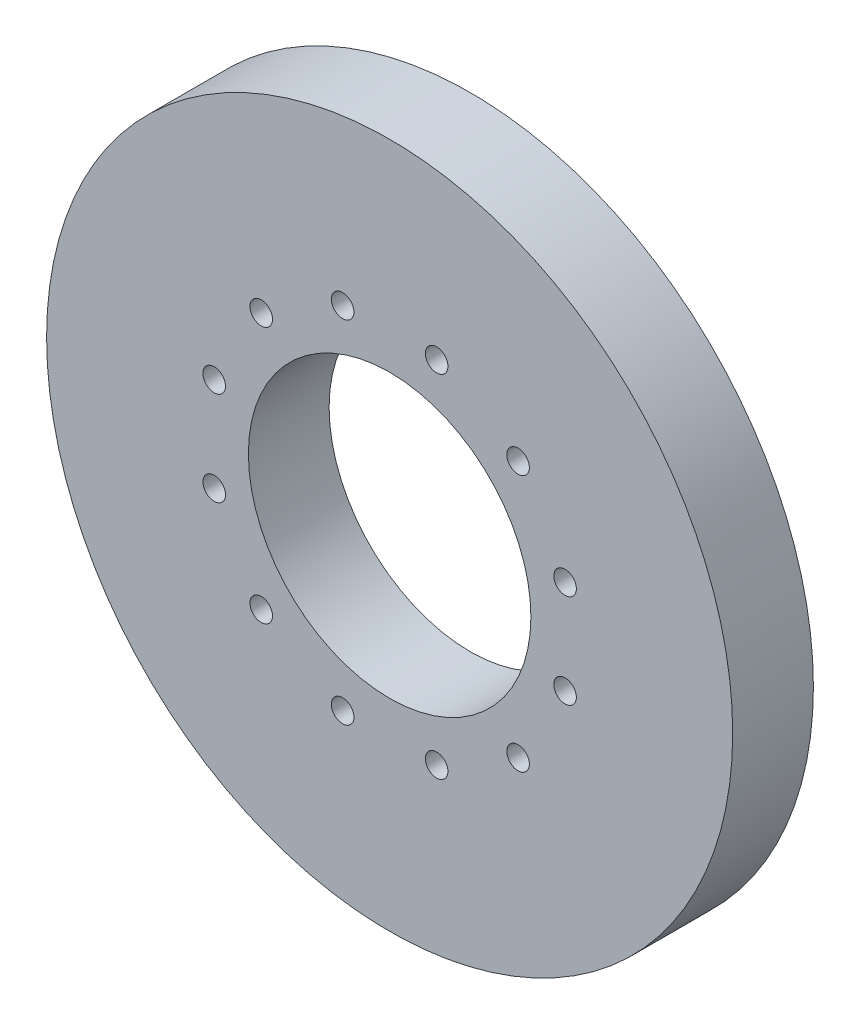
ISO-10303-21;
HEADER;
FILE_DESCRIPTION(('STEP AP214'),'2;1');
FILE_NAME('part.step','',(''),(''),'','','');
FILE_SCHEMA(('AUTOMOTIVE_DESIGN { 1 0 10303 214 1 1 1 1 }'));
ENDSEC;
DATA;
#1=APPLICATION_CONTEXT('core data for automotive mechanical design processes');
#2=APPLICATION_PROTOCOL_DEFINITION('international standard','automotive_design',2000,#1);
#3=PRODUCT_CONTEXT('',#1,'mechanical');
#4=PRODUCT('Part','Part','',(#3));
#5=PRODUCT_RELATED_PRODUCT_CATEGORY('part','',(#4));
#6=PRODUCT_DEFINITION_FORMATION('','',#4);
#7=PRODUCT_DEFINITION_CONTEXT('part definition',#1,'design');
#8=PRODUCT_DEFINITION('design','',#6,#7);
#9=PRODUCT_DEFINITION_SHAPE('','',#8);
#10=(LENGTH_UNIT() NAMED_UNIT(*) SI_UNIT(.MILLI.,.METRE.));
#11=(NAMED_UNIT(*) PLANE_ANGLE_UNIT() SI_UNIT($,.RADIAN.));
#12=(NAMED_UNIT(*) SI_UNIT($,.STERADIAN.) SOLID_ANGLE_UNIT());
#13=UNCERTAINTY_MEASURE_WITH_UNIT(LENGTH_MEASURE(1.E-05),#10,'distance_accuracy_value','');
#14=(GEOMETRIC_REPRESENTATION_CONTEXT(3) GLOBAL_UNCERTAINTY_ASSIGNED_CONTEXT((#13)) GLOBAL_UNIT_ASSIGNED_CONTEXT((#10,
#11,#12)) REPRESENTATION_CONTEXT('',''));
#15=CARTESIAN_POINT('',(0.,0.,0.));
#16=DIRECTION('',(0.,0.,1.));
#17=DIRECTION('',(1.,0.,0.));
#18=AXIS2_PLACEMENT_3D('',#15,#16,#17);
#19=CARTESIAN_POINT('',(0.,0.,10.));
#20=DIRECTION('',(0.,0.,1.));
#21=DIRECTION('',(1.,0.,0.));
#22=AXIS2_PLACEMENT_3D('',#19,#20,#21);
#23=PLANE('',#22);
#24=CARTESIAN_POINT('',(21.7333310915041,-5.82342851480657,10.));
#25=DIRECTION('',(0.,0.,1.));
#26=DIRECTION('',(0.866025403784445,-0.499999999999989,0.));
#27=AXIS2_PLACEMENT_3D('',#24,#25,#26);
#28=CIRCLE('',#27,1.4);
#29=CARTESIAN_POINT('',(22.9457666568023,-6.52342851480656,10.));
#30=VERTEX_POINT('',#29);
#31=EDGE_CURVE('E63',#30,#30,#28,.T.);
#32=ORIENTED_EDGE('',*,*,#31,.F.);
#33=EDGE_LOOP('',(#32));
#34=FACE_BOUND('',#33,.T.);
#35=CARTESIAN_POINT('',(15.9099025766974,-15.9099025766972,10.));
#36=DIRECTION('',(0.,0.,1.));
#37=DIRECTION('',(0.50000000000001,-0.866025403784433,0.));
#38=AXIS2_PLACEMENT_3D('',#35,#36,#37);
#39=CIRCLE('',#38,1.4);
#40=CARTESIAN_POINT('',(16.6099025766974,-17.1223381419954,10.));
#41=VERTEX_POINT('',#40);
#42=EDGE_CURVE('E70',#41,#41,#39,.T.);
#43=ORIENTED_EDGE('',*,*,#42,.F.);
#44=EDGE_LOOP('',(#43));
#45=FACE_BOUND('',#44,.T.);
#46=CARTESIAN_POINT('',(5.82342851480681,-21.733331091504,10.));
#47=DIRECTION('',(0.,0.,1.));
#48=DIRECTION('',(0.,-1.,0.));
#49=AXIS2_PLACEMENT_3D('',#46,#47,#48);
#50=CIRCLE('',#49,1.4);
#51=CARTESIAN_POINT('',(5.82342851480682,-23.133331091504,10.));
#52=VERTEX_POINT('',#51);
#53=EDGE_CURVE('E76',#52,#52,#50,.T.);
#54=ORIENTED_EDGE('',*,*,#53,.F.);
#55=EDGE_LOOP('',(#54));
#56=FACE_BOUND('',#55,.T.);
#57=CARTESIAN_POINT('',(-5.82342851480665,-21.7333310915041,10.));
#58=DIRECTION('',(0.,0.,1.));
#59=DIRECTION('',(-0.499999999999992,-0.866025403784443,0.));
#60=AXIS2_PLACEMENT_3D('',#57,#58,#59);
#61=CIRCLE('',#60,1.4);
#62=CARTESIAN_POINT('',(-6.52342851480664,-22.9457666568023,10.));
#63=VERTEX_POINT('',#62);
#64=EDGE_CURVE('E82',#63,#63,#61,.T.);
#65=ORIENTED_EDGE('',*,*,#64,.F.);
#66=EDGE_LOOP('',(#65));
#67=FACE_BOUND('',#66,.T.);
#68=CARTESIAN_POINT('',(-15.9099025766973,-15.9099025766973,10.));
#69=DIRECTION('',(0.,0.,1.));
#70=DIRECTION('',(-0.866025403784435,-0.500000000000007,0.));
#71=AXIS2_PLACEMENT_3D('',#68,#69,#70);
#72=CIRCLE('',#71,1.4);
#73=CARTESIAN_POINT('',(-17.1223381419955,-16.6099025766974,10.));
#74=VERTEX_POINT('',#73);
#75=EDGE_CURVE('E88',#74,#74,#72,.T.);
#76=ORIENTED_EDGE('',*,*,#75,.F.);
#77=EDGE_LOOP('',(#76));
#78=FACE_BOUND('',#77,.T.);
#79=CARTESIAN_POINT('',(-21.7333310915041,-5.82342851480658,10.));
#80=DIRECTION('',(0.,0.,1.));
#81=DIRECTION('',(-1.,0.,0.));
#82=AXIS2_PLACEMENT_3D('',#79,#80,#81);
#83=CIRCLE('',#82,1.4);
#84=CARTESIAN_POINT('',(-23.1333310915041,-5.82342851480658,10.));
#85=VERTEX_POINT('',#84);
#86=EDGE_CURVE('E94',#85,#85,#83,.T.);
#87=ORIENTED_EDGE('',*,*,#86,.F.);
#88=EDGE_LOOP('',(#87));
#89=FACE_BOUND('',#88,.T.);
#90=CARTESIAN_POINT('',(-21.733331091504,5.82342851480673,10.));
#91=DIRECTION('',(0.,0.,1.));
#92=DIRECTION('',(-0.866025403784442,0.499999999999995,0.));
#93=AXIS2_PLACEMENT_3D('',#90,#91,#92);
#94=CIRCLE('',#93,1.4);
#95=CARTESIAN_POINT('',(-22.9457666568023,6.52342851480672,10.));
#96=VERTEX_POINT('',#95);
#97=EDGE_CURVE('E100',#96,#96,#94,.T.);
#98=ORIENTED_EDGE('',*,*,#97,.F.);
#99=EDGE_LOOP('',(#98));
#100=FACE_BOUND('',#99,.T.);
#101=CARTESIAN_POINT('',(-15.9099025766973,15.9099025766973,10.));
#102=DIRECTION('',(0.,0.,1.));
#103=DIRECTION('',(-0.500000000000004,0.866025403784436,0.));
#104=AXIS2_PLACEMENT_3D('',#101,#102,#103);
#105=CIRCLE('',#104,1.4);
#106=CARTESIAN_POINT('',(-16.6099025766973,17.1223381419956,10.));
#107=VERTEX_POINT('',#106);
#108=EDGE_CURVE('E106',#107,#107,#105,.T.);
#109=ORIENTED_EDGE('',*,*,#108,.F.);
#110=EDGE_LOOP('',(#109));
#111=FACE_BOUND('',#110,.T.);
#112=CARTESIAN_POINT('',(-5.82342851480665,21.733331091504,10.));
#113=DIRECTION('',(0.,0.,1.));
#114=DIRECTION('',(0.,1.,0.));
#115=AXIS2_PLACEMENT_3D('',#112,#113,#114);
#116=CIRCLE('',#115,1.4);
#117=CARTESIAN_POINT('',(-5.82342851480666,23.1333310915041,10.));
#118=VERTEX_POINT('',#117);
#119=EDGE_CURVE('E112',#118,#118,#116,.T.);
#120=ORIENTED_EDGE('',*,*,#119,.F.);
#121=EDGE_LOOP('',(#120));
#122=FACE_BOUND('',#121,.T.);
#123=CARTESIAN_POINT('',(5.8234285148068,21.733331091504,10.));
#124=DIRECTION('',(0.,0.,1.));
#125=DIRECTION('',(0.499999999999998,0.86602540378444,0.));
#126=AXIS2_PLACEMENT_3D('',#123,#124,#125);
#127=CIRCLE('',#126,1.4);
#128=CARTESIAN_POINT('',(6.5234285148068,22.9457666568022,10.));
#129=VERTEX_POINT('',#128);
#130=EDGE_CURVE('E62',#129,#129,#127,.T.);
#131=ORIENTED_EDGE('',*,*,#130,.F.);
#132=EDGE_LOOP('',(#131));
#133=FACE_BOUND('',#132,.T.);
#134=CARTESIAN_POINT('',(15.9099025766974,15.9099025766972,10.));
#135=DIRECTION('',(0.,0.,1.));
#136=DIRECTION('',(0.866025403784438,0.500000000000001,0.));
#137=AXIS2_PLACEMENT_3D('',#134,#135,#136);
#138=CIRCLE('',#137,1.4);
#139=CARTESIAN_POINT('',(17.1223381419956,16.6099025766972,10.));
#140=VERTEX_POINT('',#139);
#141=EDGE_CURVE('E54',#140,#140,#138,.T.);
#142=ORIENTED_EDGE('',*,*,#141,.F.);
#143=EDGE_LOOP('',(#142));
#144=FACE_BOUND('',#143,.T.);
#145=CARTESIAN_POINT('',(21.7333310915041,5.82342851480658,10.));
#146=DIRECTION('',(0.,0.,1.));
#147=DIRECTION('',(1.,0.,0.));
#148=AXIS2_PLACEMENT_3D('',#145,#146,#147);
#149=CIRCLE('',#148,1.4);
#150=CARTESIAN_POINT('',(23.1333310915041,5.82342851480658,10.));
#151=VERTEX_POINT('',#150);
#152=EDGE_CURVE('E51',#151,#151,#149,.T.);
#153=ORIENTED_EDGE('',*,*,#152,.F.);
#154=EDGE_LOOP('',(#153));
#155=FACE_BOUND('',#154,.T.);
#156=CARTESIAN_POINT('',(0.,0.,10.));
#157=DIRECTION('',(0.,0.,1.));
#158=DIRECTION('',(1.,0.,0.));
#159=AXIS2_PLACEMENT_3D('',#156,#157,#158);
#160=CIRCLE('',#159,42.5);
#161=CARTESIAN_POINT('',(42.5,0.,10.));
#162=VERTEX_POINT('',#161);
#163=EDGE_CURVE('E10',#162,#162,#160,.T.);
#164=ORIENTED_EDGE('',*,*,#163,.T.);
#165=EDGE_LOOP('',(#164));
#166=FACE_BOUND('',#165,.T.);
#167=CARTESIAN_POINT('',(0.,0.,10.));
#168=DIRECTION('',(0.,0.,1.));
#169=DIRECTION('',(1.,0.,0.));
#170=AXIS2_PLACEMENT_3D('',#167,#168,#169);
#171=CIRCLE('',#170,17.5);
#172=CARTESIAN_POINT('',(17.5,0.,10.));
#173=VERTEX_POINT('',#172);
#174=EDGE_CURVE('E43',#173,#173,#171,.T.);
#175=ORIENTED_EDGE('',*,*,#174,.F.);
#176=EDGE_LOOP('',(#175));
#177=FACE_BOUND('',#176,.T.);
#178=ADVANCED_FACE('F32',(#34,#45,#56,#67,#78,#89,#100,#111,#122,#133,#144,#155,#166,#177),#23,.T.);
#179=CARTESIAN_POINT('',(0.,0.,0.));
#180=DIRECTION('',(0.,0.,1.));
#181=DIRECTION('',(1.,0.,0.));
#182=AXIS2_PLACEMENT_3D('',#179,#180,#181);
#183=PLANE('',#182);
#184=CARTESIAN_POINT('',(21.7333310915041,-5.82342851480657,0.));
#185=DIRECTION('',(0.,0.,1.));
#186=DIRECTION('',(0.866025403784445,-0.499999999999989,0.));
#187=AXIS2_PLACEMENT_3D('',#184,#185,#186);
#188=CIRCLE('',#187,1.4);
#189=CARTESIAN_POINT('',(22.9457666568023,-6.52342851480656,0.));
#190=VERTEX_POINT('',#189);
#191=EDGE_CURVE('E67',#190,#190,#188,.T.);
#192=ORIENTED_EDGE('',*,*,#191,.T.);
#193=EDGE_LOOP('',(#192));
#194=FACE_BOUND('',#193,.T.);
#195=CARTESIAN_POINT('',(15.9099025766974,-15.9099025766972,0.));
#196=DIRECTION('',(0.,0.,1.));
#197=DIRECTION('',(0.50000000000001,-0.866025403784433,0.));
#198=AXIS2_PLACEMENT_3D('',#195,#196,#197);
#199=CIRCLE('',#198,1.4);
#200=CARTESIAN_POINT('',(16.6099025766974,-17.1223381419954,0.));
#201=VERTEX_POINT('',#200);
#202=EDGE_CURVE('E66',#201,#201,#199,.T.);
#203=ORIENTED_EDGE('',*,*,#202,.T.);
#204=EDGE_LOOP('',(#203));
#205=FACE_BOUND('',#204,.T.);
#206=CARTESIAN_POINT('',(5.82342851480681,-21.733331091504,0.));
#207=DIRECTION('',(0.,0.,1.));
#208=DIRECTION('',(0.,-1.,0.));
#209=AXIS2_PLACEMENT_3D('',#206,#207,#208);
#210=CIRCLE('',#209,1.4);
#211=CARTESIAN_POINT('',(5.82342851480682,-23.133331091504,0.));
#212=VERTEX_POINT('',#211);
#213=EDGE_CURVE('E73',#212,#212,#210,.T.);
#214=ORIENTED_EDGE('',*,*,#213,.T.);
#215=EDGE_LOOP('',(#214));
#216=FACE_BOUND('',#215,.T.);
#217=CARTESIAN_POINT('',(-5.82342851480665,-21.7333310915041,0.));
#218=DIRECTION('',(0.,0.,1.));
#219=DIRECTION('',(-0.499999999999992,-0.866025403784443,0.));
#220=AXIS2_PLACEMENT_3D('',#217,#218,#219);
#221=CIRCLE('',#220,1.4);
#222=CARTESIAN_POINT('',(-6.52342851480664,-22.9457666568023,0.));
#223=VERTEX_POINT('',#222);
#224=EDGE_CURVE('E79',#223,#223,#221,.T.);
#225=ORIENTED_EDGE('',*,*,#224,.T.);
#226=EDGE_LOOP('',(#225));
#227=FACE_BOUND('',#226,.T.);
#228=CARTESIAN_POINT('',(-15.9099025766973,-15.9099025766973,0.));
#229=DIRECTION('',(0.,0.,1.));
#230=DIRECTION('',(-0.866025403784435,-0.500000000000007,0.));
#231=AXIS2_PLACEMENT_3D('',#228,#229,#230);
#232=CIRCLE('',#231,1.4);
#233=CARTESIAN_POINT('',(-17.1223381419955,-16.6099025766974,0.));
#234=VERTEX_POINT('',#233);
#235=EDGE_CURVE('E85',#234,#234,#232,.T.);
#236=ORIENTED_EDGE('',*,*,#235,.T.);
#237=EDGE_LOOP('',(#236));
#238=FACE_BOUND('',#237,.T.);
#239=CARTESIAN_POINT('',(-21.7333310915041,-5.82342851480658,0.));
#240=DIRECTION('',(0.,0.,1.));
#241=DIRECTION('',(-1.,0.,0.));
#242=AXIS2_PLACEMENT_3D('',#239,#240,#241);
#243=CIRCLE('',#242,1.4);
#244=CARTESIAN_POINT('',(-23.1333310915041,-5.82342851480658,0.));
#245=VERTEX_POINT('',#244);
#246=EDGE_CURVE('E91',#245,#245,#243,.T.);
#247=ORIENTED_EDGE('',*,*,#246,.T.);
#248=EDGE_LOOP('',(#247));
#249=FACE_BOUND('',#248,.T.);
#250=CARTESIAN_POINT('',(-21.733331091504,5.82342851480673,0.));
#251=DIRECTION('',(0.,0.,1.));
#252=DIRECTION('',(-0.866025403784442,0.499999999999995,0.));
#253=AXIS2_PLACEMENT_3D('',#250,#251,#252);
#254=CIRCLE('',#253,1.4);
#255=CARTESIAN_POINT('',(-22.9457666568023,6.52342851480672,0.));
#256=VERTEX_POINT('',#255);
#257=EDGE_CURVE('E97',#256,#256,#254,.T.);
#258=ORIENTED_EDGE('',*,*,#257,.T.);
#259=EDGE_LOOP('',(#258));
#260=FACE_BOUND('',#259,.T.);
#261=CARTESIAN_POINT('',(-15.9099025766973,15.9099025766973,0.));
#262=DIRECTION('',(0.,0.,1.));
#263=DIRECTION('',(-0.500000000000004,0.866025403784436,0.));
#264=AXIS2_PLACEMENT_3D('',#261,#262,#263);
#265=CIRCLE('',#264,1.4);
#266=CARTESIAN_POINT('',(-16.6099025766973,17.1223381419956,0.));
#267=VERTEX_POINT('',#266);
#268=EDGE_CURVE('E103',#267,#267,#265,.T.);
#269=ORIENTED_EDGE('',*,*,#268,.T.);
#270=EDGE_LOOP('',(#269));
#271=FACE_BOUND('',#270,.T.);
#272=CARTESIAN_POINT('',(-5.82342851480665,21.733331091504,0.));
#273=DIRECTION('',(0.,0.,1.));
#274=DIRECTION('',(0.,1.,0.));
#275=AXIS2_PLACEMENT_3D('',#272,#273,#274);
#276=CIRCLE('',#275,1.4);
#277=CARTESIAN_POINT('',(-5.82342851480666,23.1333310915041,0.));
#278=VERTEX_POINT('',#277);
#279=EDGE_CURVE('E109',#278,#278,#276,.T.);
#280=ORIENTED_EDGE('',*,*,#279,.T.);
#281=EDGE_LOOP('',(#280));
#282=FACE_BOUND('',#281,.T.);
#283=CARTESIAN_POINT('',(5.8234285148068,21.733331091504,0.));
#284=DIRECTION('',(0.,0.,1.));
#285=DIRECTION('',(0.499999999999998,0.86602540378444,0.));
#286=AXIS2_PLACEMENT_3D('',#283,#284,#285);
#287=CIRCLE('',#286,1.4);
#288=CARTESIAN_POINT('',(6.5234285148068,22.9457666568022,0.));
#289=VERTEX_POINT('',#288);
#290=EDGE_CURVE('E115',#289,#289,#287,.T.);
#291=ORIENTED_EDGE('',*,*,#290,.T.);
#292=EDGE_LOOP('',(#291));
#293=FACE_BOUND('',#292,.T.);
#294=CARTESIAN_POINT('',(15.9099025766974,15.9099025766972,0.));
#295=DIRECTION('',(0.,0.,1.));
#296=DIRECTION('',(0.866025403784438,0.500000000000001,0.));
#297=AXIS2_PLACEMENT_3D('',#294,#295,#296);
#298=CIRCLE('',#297,1.4);
#299=CARTESIAN_POINT('',(17.1223381419956,16.6099025766972,0.));
#300=VERTEX_POINT('',#299);
#301=EDGE_CURVE('E59',#300,#300,#298,.T.);
#302=ORIENTED_EDGE('',*,*,#301,.T.);
#303=EDGE_LOOP('',(#302));
#304=FACE_BOUND('',#303,.T.);
#305=CARTESIAN_POINT('',(21.7333310915041,5.82342851480658,0.));
#306=DIRECTION('',(0.,0.,1.));
#307=DIRECTION('',(1.,0.,0.));
#308=AXIS2_PLACEMENT_3D('',#305,#306,#307);
#309=CIRCLE('',#308,1.4);
#310=CARTESIAN_POINT('',(23.1333310915041,5.82342851480658,0.));
#311=VERTEX_POINT('',#310);
#312=EDGE_CURVE('E48',#311,#311,#309,.T.);
#313=ORIENTED_EDGE('',*,*,#312,.T.);
#314=EDGE_LOOP('',(#313));
#315=FACE_BOUND('',#314,.T.);
#316=CARTESIAN_POINT('',(0.,0.,0.));
#317=DIRECTION('',(0.,0.,1.));
#318=DIRECTION('',(1.,0.,0.));
#319=AXIS2_PLACEMENT_3D('',#316,#317,#318);
#320=CIRCLE('',#319,42.5);
#321=CARTESIAN_POINT('',(42.5,0.,0.));
#322=VERTEX_POINT('',#321);
#323=EDGE_CURVE('E36',#322,#322,#320,.T.);
#324=ORIENTED_EDGE('',*,*,#323,.F.);
#325=EDGE_LOOP('',(#324));
#326=FACE_BOUND('',#325,.T.);
#327=CARTESIAN_POINT('',(0.,0.,0.));
#328=DIRECTION('',(0.,0.,1.));
#329=DIRECTION('',(1.,0.,0.));
#330=AXIS2_PLACEMENT_3D('',#327,#328,#329);
#331=CIRCLE('',#330,17.5);
#332=CARTESIAN_POINT('',(17.5,0.,0.));
#333=VERTEX_POINT('',#332);
#334=EDGE_CURVE('E45',#333,#333,#331,.T.);
#335=ORIENTED_EDGE('',*,*,#334,.T.);
#336=EDGE_LOOP('',(#335));
#337=FACE_BOUND('',#336,.T.);
#338=ADVANCED_FACE('F123',(#194,#205,#216,#227,#238,#249,#260,#271,#282,#293,#304,#315,#326,
#337),#183,.F.);
#339=CARTESIAN_POINT('',(0.,0.,10.));
#340=DIRECTION('',(0.,0.,-1.));
#341=DIRECTION('',(-1.,0.,0.));
#342=AXIS2_PLACEMENT_3D('',#339,#340,#341);
#343=CYLINDRICAL_SURFACE('',#342,42.5);
#344=ORIENTED_EDGE('',*,*,#163,.F.);
#345=EDGE_LOOP('',(#344));
#346=FACE_BOUND('',#345,.T.);
#347=ORIENTED_EDGE('',*,*,#323,.T.);
#348=EDGE_LOOP('',(#347));
#349=FACE_BOUND('',#348,.T.);
#350=ADVANCED_FACE('F34',(#346,#349),#343,.T.);
#351=CARTESIAN_POINT('',(0.,0.,10.));
#352=DIRECTION('',(0.,0.,-1.));
#353=DIRECTION('',(-1.,0.,0.));
#354=AXIS2_PLACEMENT_3D('',#351,#352,#353);
#355=CYLINDRICAL_SURFACE('',#354,17.5);
#356=ORIENTED_EDGE('',*,*,#174,.T.);
#357=EDGE_LOOP('',(#356));
#358=FACE_BOUND('',#357,.T.);
#359=ORIENTED_EDGE('',*,*,#334,.F.);
#360=EDGE_LOOP('',(#359));
#361=FACE_BOUND('',#360,.T.);
#362=ADVANCED_FACE('F144',(#358,#361),#355,.F.);
#363=CARTESIAN_POINT('',(21.7333310915041,5.82342851480658,0.));
#364=DIRECTION('',(0.,0.,1.));
#365=DIRECTION('',(1.,0.,0.));
#366=AXIS2_PLACEMENT_3D('',#363,#364,#365);
#367=CYLINDRICAL_SURFACE('',#366,1.4);
#368=ORIENTED_EDGE('',*,*,#312,.F.);
#369=EDGE_LOOP('',(#368));
#370=FACE_BOUND('',#369,.T.);
#371=ORIENTED_EDGE('',*,*,#152,.T.);
#372=EDGE_LOOP('',(#371));
#373=FACE_BOUND('',#372,.T.);
#374=ADVANCED_FACE('F147',(#370,#373),#367,.F.);
#375=CARTESIAN_POINT('',(15.9099025766974,15.9099025766972,0.));
#376=DIRECTION('',(0.,0.,1.));
#377=DIRECTION('',(0.866025403784438,0.500000000000001,0.));
#378=AXIS2_PLACEMENT_3D('',#375,#376,#377);
#379=CYLINDRICAL_SURFACE('',#378,1.4);
#380=ORIENTED_EDGE('',*,*,#301,.F.);
#381=EDGE_LOOP('',(#380));
#382=FACE_BOUND('',#381,.T.);
#383=ORIENTED_EDGE('',*,*,#141,.T.);
#384=EDGE_LOOP('',(#383));
#385=FACE_BOUND('',#384,.T.);
#386=ADVANCED_FACE('F130',(#382,#385),#379,.F.);
#387=CARTESIAN_POINT('',(5.8234285148068,21.733331091504,0.));
#388=DIRECTION('',(0.,0.,1.));
#389=DIRECTION('',(0.499999999999998,0.86602540378444,0.));
#390=AXIS2_PLACEMENT_3D('',#387,#388,#389);
#391=CYLINDRICAL_SURFACE('',#390,1.4);
#392=ORIENTED_EDGE('',*,*,#290,.F.);
#393=EDGE_LOOP('',(#392));
#394=FACE_BOUND('',#393,.T.);
#395=ORIENTED_EDGE('',*,*,#130,.T.);
#396=EDGE_LOOP('',(#395));
#397=FACE_BOUND('',#396,.T.);
#398=ADVANCED_FACE('F126',(#394,#397),#391,.F.);
#399=CARTESIAN_POINT('',(-5.82342851480665,21.733331091504,0.));
#400=DIRECTION('',(0.,0.,1.));
#401=DIRECTION('',(0.,1.,0.));
#402=AXIS2_PLACEMENT_3D('',#399,#400,#401);
#403=CYLINDRICAL_SURFACE('',#402,1.4);
#404=ORIENTED_EDGE('',*,*,#279,.F.);
#405=EDGE_LOOP('',(#404));
#406=FACE_BOUND('',#405,.T.);
#407=ORIENTED_EDGE('',*,*,#119,.T.);
#408=EDGE_LOOP('',(#407));
#409=FACE_BOUND('',#408,.T.);
#410=ADVANCED_FACE('F129',(#406,#409),#403,.F.);
#411=CARTESIAN_POINT('',(-15.9099025766973,15.9099025766973,0.));
#412=DIRECTION('',(0.,0.,1.));
#413=DIRECTION('',(-0.500000000000004,0.866025403784436,0.));
#414=AXIS2_PLACEMENT_3D('',#411,#412,#413);
#415=CYLINDRICAL_SURFACE('',#414,1.4);
#416=ORIENTED_EDGE('',*,*,#268,.F.);
#417=EDGE_LOOP('',(#416));
#418=FACE_BOUND('',#417,.T.);
#419=ORIENTED_EDGE('',*,*,#108,.T.);
#420=EDGE_LOOP('',(#419));
#421=FACE_BOUND('',#420,.T.);
#422=ADVANCED_FACE('F192',(#418,#421),#415,.F.);
#423=CARTESIAN_POINT('',(-21.733331091504,5.82342851480673,0.));
#424=DIRECTION('',(0.,0.,1.));
#425=DIRECTION('',(-0.866025403784442,0.499999999999995,0.));
#426=AXIS2_PLACEMENT_3D('',#423,#424,#425);
#427=CYLINDRICAL_SURFACE('',#426,1.4);
#428=ORIENTED_EDGE('',*,*,#257,.F.);
#429=EDGE_LOOP('',(#428));
#430=FACE_BOUND('',#429,.T.);
#431=ORIENTED_EDGE('',*,*,#97,.T.);
#432=EDGE_LOOP('',(#431));
#433=FACE_BOUND('',#432,.T.);
#434=ADVANCED_FACE('F188',(#430,#433),#427,.F.);
#435=CARTESIAN_POINT('',(-21.7333310915041,-5.82342851480658,0.));
#436=DIRECTION('',(0.,0.,1.));
#437=DIRECTION('',(-1.,0.,0.));
#438=AXIS2_PLACEMENT_3D('',#435,#436,#437);
#439=CYLINDRICAL_SURFACE('',#438,1.4);
#440=ORIENTED_EDGE('',*,*,#246,.F.);
#441=EDGE_LOOP('',(#440));
#442=FACE_BOUND('',#441,.T.);
#443=ORIENTED_EDGE('',*,*,#86,.T.);
#444=EDGE_LOOP('',(#443));
#445=FACE_BOUND('',#444,.T.);
#446=ADVANCED_FACE('F184',(#442,#445),#439,.F.);
#447=CARTESIAN_POINT('',(-15.9099025766973,-15.9099025766973,0.));
#448=DIRECTION('',(0.,0.,1.));
#449=DIRECTION('',(-0.866025403784435,-0.500000000000007,0.));
#450=AXIS2_PLACEMENT_3D('',#447,#448,#449);
#451=CYLINDRICAL_SURFACE('',#450,1.4);
#452=ORIENTED_EDGE('',*,*,#235,.F.);
#453=EDGE_LOOP('',(#452));
#454=FACE_BOUND('',#453,.T.);
#455=ORIENTED_EDGE('',*,*,#75,.T.);
#456=EDGE_LOOP('',(#455));
#457=FACE_BOUND('',#456,.T.);
#458=ADVANCED_FACE('F180',(#454,#457),#451,.F.);
#459=CARTESIAN_POINT('',(-5.82342851480665,-21.7333310915041,0.));
#460=DIRECTION('',(0.,0.,1.));
#461=DIRECTION('',(-0.499999999999992,-0.866025403784443,0.));
#462=AXIS2_PLACEMENT_3D('',#459,#460,#461);
#463=CYLINDRICAL_SURFACE('',#462,1.4);
#464=ORIENTED_EDGE('',*,*,#224,.F.);
#465=EDGE_LOOP('',(#464));
#466=FACE_BOUND('',#465,.T.);
#467=ORIENTED_EDGE('',*,*,#64,.T.);
#468=EDGE_LOOP('',(#467));
#469=FACE_BOUND('',#468,.T.);
#470=ADVANCED_FACE('F176',(#466,#469),#463,.F.);
#471=CARTESIAN_POINT('',(5.82342851480681,-21.733331091504,0.));
#472=DIRECTION('',(0.,0.,1.));
#473=DIRECTION('',(0.,-1.,0.));
#474=AXIS2_PLACEMENT_3D('',#471,#472,#473);
#475=CYLINDRICAL_SURFACE('',#474,1.4);
#476=ORIENTED_EDGE('',*,*,#213,.F.);
#477=EDGE_LOOP('',(#476));
#478=FACE_BOUND('',#477,.T.);
#479=ORIENTED_EDGE('',*,*,#53,.T.);
#480=EDGE_LOOP('',(#479));
#481=FACE_BOUND('',#480,.T.);
#482=ADVANCED_FACE('F172',(#478,#481),#475,.F.);
#483=CARTESIAN_POINT('',(15.9099025766974,-15.9099025766972,0.));
#484=DIRECTION('',(0.,0.,1.));
#485=DIRECTION('',(0.50000000000001,-0.866025403784433,0.));
#486=AXIS2_PLACEMENT_3D('',#483,#484,#485);
#487=CYLINDRICAL_SURFACE('',#486,1.4);
#488=ORIENTED_EDGE('',*,*,#202,.F.);
#489=EDGE_LOOP('',(#488));
#490=FACE_BOUND('',#489,.T.);
#491=ORIENTED_EDGE('',*,*,#42,.T.);
#492=EDGE_LOOP('',(#491));
#493=FACE_BOUND('',#492,.T.);
#494=ADVANCED_FACE('F168',(#490,#493),#487,.F.);
#495=CARTESIAN_POINT('',(21.7333310915041,-5.82342851480657,0.));
#496=DIRECTION('',(0.,0.,1.));
#497=DIRECTION('',(0.866025403784445,-0.499999999999989,0.));
#498=AXIS2_PLACEMENT_3D('',#495,#496,#497);
#499=CYLINDRICAL_SURFACE('',#498,1.4);
#500=ORIENTED_EDGE('',*,*,#191,.F.);
#501=EDGE_LOOP('',(#500));
#502=FACE_BOUND('',#501,.T.);
#503=ORIENTED_EDGE('',*,*,#31,.T.);
#504=EDGE_LOOP('',(#503));
#505=FACE_BOUND('',#504,.T.);
#506=ADVANCED_FACE('F165',(#502,#505),#499,.F.);
#507=CLOSED_SHELL('',(#178,#338,#350,#362,#374,#386,#398,#410,#422,#434,#446,#458,#470,#482,
#494,#506));
#508=MANIFOLD_SOLID_BREP('B2',#507);
#509=ADVANCED_BREP_SHAPE_REPRESENTATION('',(#18,#508),#14);
#510=SHAPE_DEFINITION_REPRESENTATION(#9,#509);
ENDSEC;
END-ISO-10303-21;
